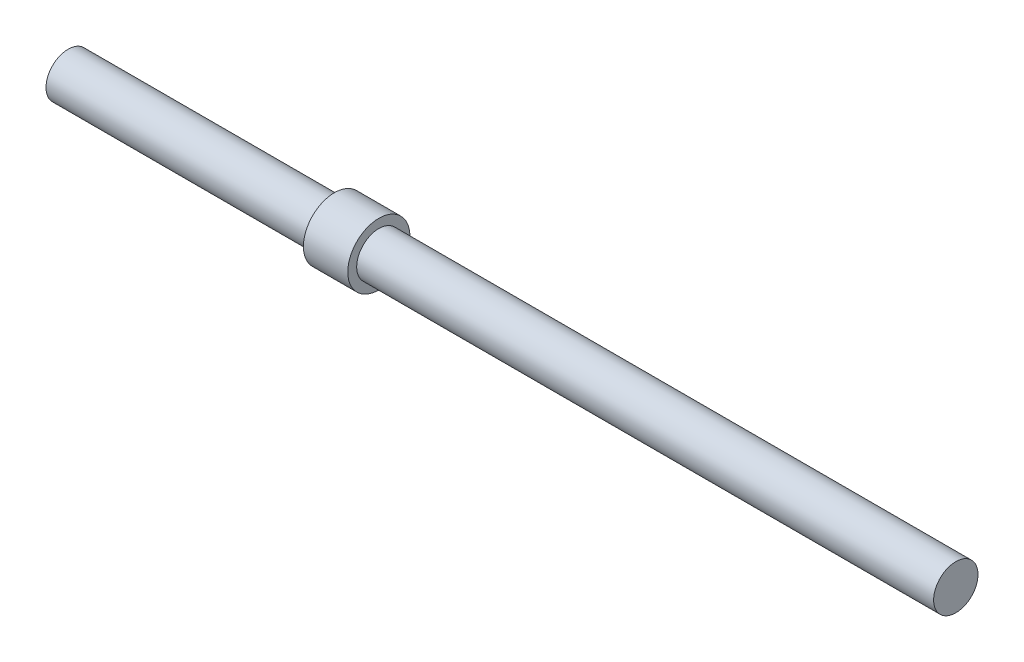
ISO-10303-21;
HEADER;
FILE_DESCRIPTION(('STEP AP214'),'2;1');
FILE_NAME('part.step','',(''),(''),'','','');
FILE_SCHEMA(('AUTOMOTIVE_DESIGN { 1 0 10303 214 1 1 1 1 }'));
ENDSEC;
DATA;
#1=APPLICATION_CONTEXT('core data for automotive mechanical design processes');
#2=APPLICATION_PROTOCOL_DEFINITION('international standard','automotive_design',2000,#1);
#3=PRODUCT_CONTEXT('',#1,'mechanical');
#4=PRODUCT('Part','Part','',(#3));
#5=PRODUCT_RELATED_PRODUCT_CATEGORY('part','',(#4));
#6=PRODUCT_DEFINITION_FORMATION('','',#4);
#7=PRODUCT_DEFINITION_CONTEXT('part definition',#1,'design');
#8=PRODUCT_DEFINITION('design','',#6,#7);
#9=PRODUCT_DEFINITION_SHAPE('','',#8);
#10=(LENGTH_UNIT() NAMED_UNIT(*) SI_UNIT(.MILLI.,.METRE.));
#11=(NAMED_UNIT(*) PLANE_ANGLE_UNIT() SI_UNIT($,.RADIAN.));
#12=(NAMED_UNIT(*) SI_UNIT($,.STERADIAN.) SOLID_ANGLE_UNIT());
#13=UNCERTAINTY_MEASURE_WITH_UNIT(LENGTH_MEASURE(1.E-05),#10,'distance_accuracy_value','');
#14=(GEOMETRIC_REPRESENTATION_CONTEXT(3) GLOBAL_UNCERTAINTY_ASSIGNED_CONTEXT((#13)) GLOBAL_UNIT_ASSIGNED_CONTEXT((#10,
#11,#12)) REPRESENTATION_CONTEXT('',''));
#15=CARTESIAN_POINT('',(0.,0.,0.));
#16=DIRECTION('',(0.,0.,1.));
#17=DIRECTION('',(1.,0.,0.));
#18=AXIS2_PLACEMENT_3D('',#15,#16,#17);
#19=CARTESIAN_POINT('',(100.,0.,0.));
#20=DIRECTION('',(-1.,0.,0.));
#21=DIRECTION('',(0.,0.,1.));
#22=AXIS2_PLACEMENT_3D('',#19,#20,#21);
#23=CYLINDRICAL_SURFACE('',#22,5.);
#24=CARTESIAN_POINT('',(-40.,0.,0.));
#25=DIRECTION('',(-1.,0.,0.));
#26=DIRECTION('',(0.,0.,1.));
#27=AXIS2_PLACEMENT_3D('',#24,#25,#26);
#28=CIRCLE('',#27,5.);
#29=CARTESIAN_POINT('',(-40.,0.,5.));
#30=VERTEX_POINT('',#29);
#31=EDGE_CURVE('E37',#30,#30,#28,.T.);
#32=ORIENTED_EDGE('',*,*,#31,.T.);
#33=EDGE_LOOP('',(#32));
#34=FACE_BOUND('',#33,.T.);
#35=CARTESIAN_POINT('',(-100.,0.,0.));
#36=DIRECTION('',(1.,0.,0.));
#37=DIRECTION('',(0.,0.,-1.));
#38=AXIS2_PLACEMENT_3D('',#35,#36,#37);
#39=CIRCLE('',#38,5.);
#40=CARTESIAN_POINT('',(-100.,0.,-5.));
#41=VERTEX_POINT('',#40);
#42=EDGE_CURVE('E48',#41,#41,#39,.T.);
#43=ORIENTED_EDGE('',*,*,#42,.T.);
#44=EDGE_LOOP('',(#43));
#45=FACE_BOUND('',#44,.T.);
#46=ADVANCED_FACE('F40',(#34,#45),#23,.T.);
#47=CARTESIAN_POINT('',(-100.,0.,0.));
#48=DIRECTION('',(1.,0.,0.));
#49=DIRECTION('',(0.,0.,-1.));
#50=AXIS2_PLACEMENT_3D('',#47,#48,#49);
#51=PLANE('',#50);
#52=ORIENTED_EDGE('',*,*,#42,.F.);
#53=EDGE_LOOP('',(#52));
#54=FACE_BOUND('',#53,.T.);
#55=ADVANCED_FACE('F78',(#54),#51,.F.);
#56=CARTESIAN_POINT('',(-40.,0.,0.));
#57=DIRECTION('',(1.,0.,0.));
#58=DIRECTION('',(0.,0.,-1.));
#59=AXIS2_PLACEMENT_3D('',#56,#57,#58);
#60=CYLINDRICAL_SURFACE('',#59,7.);
#61=CARTESIAN_POINT('',(-40.,0.,0.));
#62=DIRECTION('',(-1.,0.,0.));
#63=DIRECTION('',(0.,0.,1.));
#64=AXIS2_PLACEMENT_3D('',#61,#62,#63);
#65=CIRCLE('',#64,7.);
#66=CARTESIAN_POINT('',(-40.,0.,7.));
#67=VERTEX_POINT('',#66);
#68=EDGE_CURVE('E57',#67,#67,#65,.T.);
#69=ORIENTED_EDGE('',*,*,#68,.F.);
#70=EDGE_LOOP('',(#69));
#71=FACE_BOUND('',#70,.T.);
#72=CARTESIAN_POINT('',(-30.,0.,0.));
#73=DIRECTION('',(-1.,0.,0.));
#74=DIRECTION('',(0.,0.,1.));
#75=AXIS2_PLACEMENT_3D('',#72,#73,#74);
#76=CIRCLE('',#75,7.);
#77=CARTESIAN_POINT('',(-30.,0.,7.));
#78=VERTEX_POINT('',#77);
#79=EDGE_CURVE('E52',#78,#78,#76,.T.);
#80=ORIENTED_EDGE('',*,*,#79,.T.);
#81=EDGE_LOOP('',(#80));
#82=FACE_BOUND('',#81,.T.);
#83=ADVANCED_FACE('F66',(#71,#82),#60,.T.);
#84=CARTESIAN_POINT('',(-40.,0.,0.));
#85=DIRECTION('',(-1.,0.,0.));
#86=DIRECTION('',(0.,0.,1.));
#87=AXIS2_PLACEMENT_3D('',#84,#85,#86);
#88=PLANE('',#87);
#89=ORIENTED_EDGE('',*,*,#31,.F.);
#90=EDGE_LOOP('',(#89));
#91=FACE_BOUND('',#90,.T.);
#92=ORIENTED_EDGE('',*,*,#68,.T.);
#93=EDGE_LOOP('',(#92));
#94=FACE_BOUND('',#93,.T.);
#95=ADVANCED_FACE('F64',(#91,#94),#88,.T.);
#96=CARTESIAN_POINT('',(-30.,0.,0.));
#97=DIRECTION('',(-1.,0.,0.));
#98=DIRECTION('',(0.,0.,1.));
#99=AXIS2_PLACEMENT_3D('',#96,#97,#98);
#100=PLANE('',#99);
#101=CARTESIAN_POINT('',(-30.,0.,0.));
#102=DIRECTION('',(-1.,0.,0.));
#103=DIRECTION('',(0.,0.,1.));
#104=AXIS2_PLACEMENT_3D('',#101,#102,#103);
#105=CIRCLE('',#104,5.);
#106=CARTESIAN_POINT('',(-30.,0.,5.));
#107=VERTEX_POINT('',#106);
#108=EDGE_CURVE('E10',#107,#107,#105,.T.);
#109=ORIENTED_EDGE('',*,*,#108,.T.);
#110=EDGE_LOOP('',(#109));
#111=FACE_BOUND('',#110,.T.);
#112=ORIENTED_EDGE('',*,*,#79,.F.);
#113=EDGE_LOOP('',(#112));
#114=FACE_BOUND('',#113,.T.);
#115=ADVANCED_FACE('F70',(#111,#114),#100,.F.);
#116=CARTESIAN_POINT('',(100.,0.,0.));
#117=DIRECTION('',(1.,0.,0.));
#118=DIRECTION('',(0.,0.,-1.));
#119=AXIS2_PLACEMENT_3D('',#116,#117,#118);
#120=PLANE('',#119);
#121=CARTESIAN_POINT('',(100.,0.,0.));
#122=DIRECTION('',(1.,0.,0.));
#123=DIRECTION('',(0.,0.,-1.));
#124=AXIS2_PLACEMENT_3D('',#121,#122,#123);
#125=CIRCLE('',#124,5.);
#126=CARTESIAN_POINT('',(100.,0.,-5.));
#127=VERTEX_POINT('',#126);
#128=EDGE_CURVE('E42',#127,#127,#125,.T.);
#129=ORIENTED_EDGE('',*,*,#128,.T.);
#130=EDGE_LOOP('',(#129));
#131=FACE_BOUND('',#130,.T.);
#132=ADVANCED_FACE('F72',(#131),#120,.T.);
#133=ORIENTED_EDGE('',*,*,#128,.F.);
#134=EDGE_LOOP('',(#133));
#135=FACE_BOUND('',#134,.T.);
#136=ORIENTED_EDGE('',*,*,#108,.F.);
#137=EDGE_LOOP('',(#136));
#138=FACE_BOUND('',#137,.T.);
#139=ADVANCED_FACE('F79',(#135,#138),#23,.T.);
#140=CLOSED_SHELL('',(#46,#55,#83,#95,#115,#132,#139));
#141=MANIFOLD_SOLID_BREP('B2',#140);
#142=ADVANCED_BREP_SHAPE_REPRESENTATION('',(#18,#141),#14);
#143=SHAPE_DEFINITION_REPRESENTATION(#9,#142);
ENDSEC;
END-ISO-10303-21;
